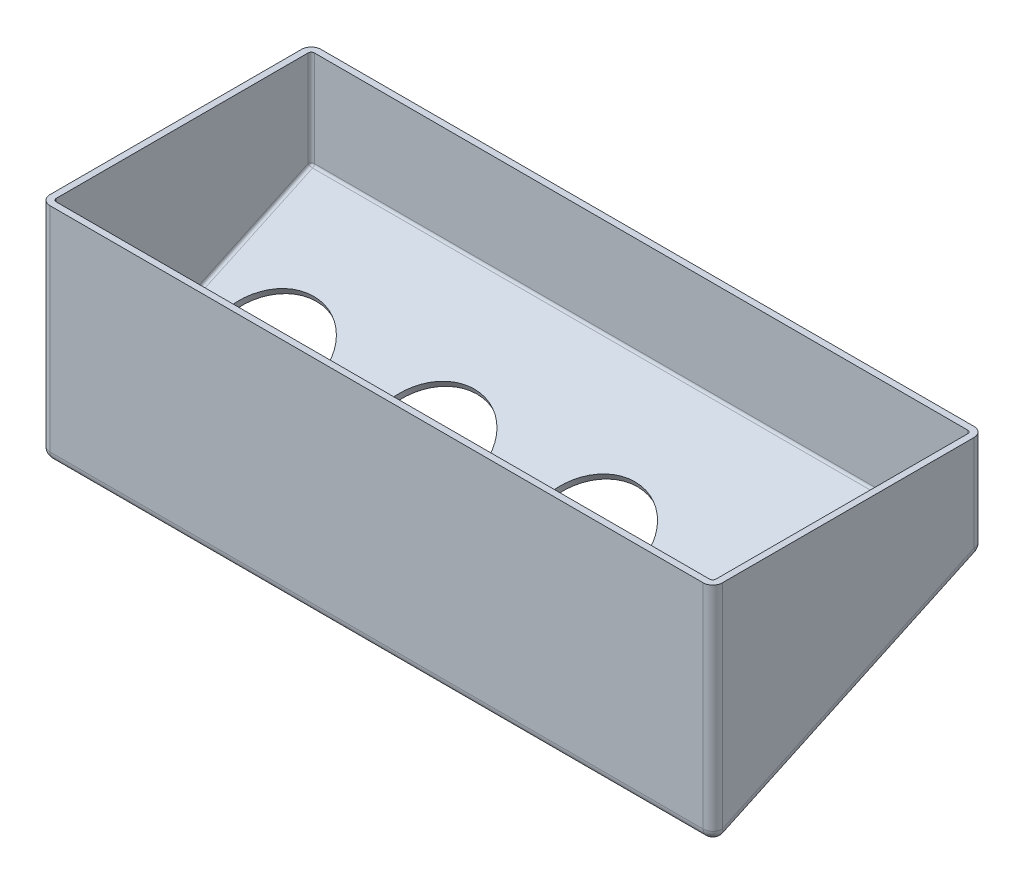
ISO-10303-21;
HEADER;
FILE_DESCRIPTION(('STEP AP214'),'2;1');
FILE_NAME('part.step','',(''),(''),'','','');
FILE_SCHEMA(('AUTOMOTIVE_DESIGN { 1 0 10303 214 1 1 1 1 }'));
ENDSEC;
DATA;
#1=APPLICATION_CONTEXT('core data for automotive mechanical design processes');
#2=APPLICATION_PROTOCOL_DEFINITION('international standard','automotive_design',2000,#1);
#3=PRODUCT_CONTEXT('',#1,'mechanical');
#4=PRODUCT('Part','Part','',(#3));
#5=PRODUCT_RELATED_PRODUCT_CATEGORY('part','',(#4));
#6=PRODUCT_DEFINITION_FORMATION('','',#4);
#7=PRODUCT_DEFINITION_CONTEXT('part definition',#1,'design');
#8=PRODUCT_DEFINITION('design','',#6,#7);
#9=PRODUCT_DEFINITION_SHAPE('','',#8);
#10=(LENGTH_UNIT() NAMED_UNIT(*) SI_UNIT(.MILLI.,.METRE.));
#11=(NAMED_UNIT(*) PLANE_ANGLE_UNIT() SI_UNIT($,.RADIAN.));
#12=(NAMED_UNIT(*) SI_UNIT($,.STERADIAN.) SOLID_ANGLE_UNIT());
#13=UNCERTAINTY_MEASURE_WITH_UNIT(LENGTH_MEASURE(1.E-05),#10,'distance_accuracy_value','');
#14=(GEOMETRIC_REPRESENTATION_CONTEXT(3) GLOBAL_UNCERTAINTY_ASSIGNED_CONTEXT((#13)) GLOBAL_UNIT_ASSIGNED_CONTEXT((#10,
#11,#12)) REPRESENTATION_CONTEXT('',''));
#15=CARTESIAN_POINT('',(0.,0.,0.));
#16=DIRECTION('',(0.,0.,1.));
#17=DIRECTION('',(1.,0.,0.));
#18=AXIS2_PLACEMENT_3D('',#15,#16,#17);
#19=CARTESIAN_POINT('',(167.4876,62.928311729549,-134.9502));
#20=DIRECTION('',(0.,0.,1.));
#21=DIRECTION('',(1.,0.,0.));
#22=AXIS2_PLACEMENT_3D('',#19,#20,#21);
#23=PLANE('',#22);
#24=DIRECTION('',(-1.,0.,0.));
#25=VECTOR('',#24,1.);
#26=CARTESIAN_POINT('',(167.4876,65.9623588466446,-134.9502));
#27=LINE('',#26,#25);
#28=CARTESIAN_POINT('',(162.7251,65.9623588466446,-134.9502));
#29=VERTEX_POINT('',#28);
#30=CARTESIAN_POINT('',(-162.7251,65.9623588466446,-134.9502));
#31=VERTEX_POINT('',#30);
#32=EDGE_CURVE('E283',#29,#31,#27,.T.);
#33=ORIENTED_EDGE('',*,*,#32,.T.);
#34=DIRECTION('',(0.,1.,0.));
#35=VECTOR('',#34,1.);
#36=CARTESIAN_POINT('',(-162.7251,62.928311729549,-134.9502));
#37=LINE('',#36,#35);
#38=CARTESIAN_POINT('',(-162.7251,113.728311729549,-134.9502));
#39=VERTEX_POINT('',#38);
#40=EDGE_CURVE('E285',#31,#39,#37,.T.);
#41=ORIENTED_EDGE('',*,*,#40,.T.);
#42=DIRECTION('',(-1.,0.,0.));
#43=VECTOR('',#42,1.);
#44=CARTESIAN_POINT('',(167.4876,113.728311729549,-134.9502));
#45=LINE('',#44,#43);
#46=CARTESIAN_POINT('',(162.7251,113.728311729549,-134.9502));
#47=VERTEX_POINT('',#46);
#48=EDGE_CURVE('E256',#47,#39,#45,.T.);
#49=ORIENTED_EDGE('',*,*,#48,.F.);
#50=DIRECTION('',(0.,1.,0.));
#51=VECTOR('',#50,1.);
#52=CARTESIAN_POINT('',(162.7251,62.928311729549,-134.9502));
#53=LINE('',#52,#51);
#54=EDGE_CURVE('E281',#47,#29,#53,.F.);
#55=ORIENTED_EDGE('',*,*,#54,.T.);
#56=EDGE_LOOP('',(#33,#41,#49,#55));
#57=FACE_BOUND('',#56,.T.);
#58=ADVANCED_FACE('F34',(#57),#23,.F.);
#59=CARTESIAN_POINT('',(167.4876,113.728311729549,-134.9502));
#60=DIRECTION('',(0.,-1.,0.));
#61=DIRECTION('',(0.,0.,-1.));
#62=AXIS2_PLACEMENT_3D('',#59,#60,#61);
#63=PLANE('',#62);
#64=DIRECTION('',(-1.,0.,0.));
#65=VECTOR('',#64,1.);
#66=CARTESIAN_POINT('',(167.4876,113.728311729549,-131.7752));
#67=LINE('',#66,#65);
#68=CARTESIAN_POINT('',(162.7251,113.728311729549,-131.7752));
#69=VERTEX_POINT('',#68);
#70=CARTESIAN_POINT('',(-162.7251,113.728311729549,-131.7752));
#71=VERTEX_POINT('',#70);
#72=EDGE_CURVE('E191',#69,#71,#67,.T.);
#73=ORIENTED_EDGE('',*,*,#72,.F.);
#74=CARTESIAN_POINT('',(162.7251,113.728311729549,-130.1877));
#75=DIRECTION('',(0.,-1.,0.));
#76=DIRECTION('',(0.,0.,-1.));
#77=AXIS2_PLACEMENT_3D('',#74,#75,#76);
#78=CIRCLE('',#77,1.5875);
#79=CARTESIAN_POINT('',(164.3126,113.728311729549,-130.1877));
#80=VERTEX_POINT('',#79);
#81=EDGE_CURVE('E240',#80,#69,#78,.F.);
#82=ORIENTED_EDGE('',*,*,#81,.F.);
#83=DIRECTION('',(0.,0.,1.));
#84=VECTOR('',#83,1.);
#85=CARTESIAN_POINT('',(164.3126,113.728311729549,-134.9502));
#86=LINE('',#85,#84);
#87=CARTESIAN_POINT('',(164.3126,113.728311729549,-4.7625));
#88=VERTEX_POINT('',#87);
#89=EDGE_CURVE('E51',#80,#88,#86,.T.);
#90=ORIENTED_EDGE('',*,*,#89,.T.);
#91=CARTESIAN_POINT('',(162.7251,113.728311729549,-4.7625));
#92=DIRECTION('',(0.,-1.,0.));
#93=DIRECTION('',(0.,0.,-1.));
#94=AXIS2_PLACEMENT_3D('',#91,#92,#93);
#95=CIRCLE('',#94,1.5875);
#96=CARTESIAN_POINT('',(162.7251,113.728311729549,-3.175));
#97=VERTEX_POINT('',#96);
#98=EDGE_CURVE('E195',#97,#88,#95,.F.);
#99=ORIENTED_EDGE('',*,*,#98,.F.);
#100=DIRECTION('',(-1.,0.,0.));
#101=VECTOR('',#100,1.);
#102=CARTESIAN_POINT('',(167.4876,113.728311729549,-3.175));
#103=LINE('',#102,#101);
#104=CARTESIAN_POINT('',(-162.7251,113.728311729549,-3.175));
#105=VERTEX_POINT('',#104);
#106=EDGE_CURVE('E230',#97,#105,#103,.T.);
#107=ORIENTED_EDGE('',*,*,#106,.T.);
#108=CARTESIAN_POINT('',(-162.7251,113.728311729549,-4.7625));
#109=DIRECTION('',(0.,-1.,0.));
#110=DIRECTION('',(0.,0.,-1.));
#111=AXIS2_PLACEMENT_3D('',#108,#109,#110);
#112=CIRCLE('',#111,1.5875);
#113=CARTESIAN_POINT('',(-164.3126,113.728311729549,-4.7625));
#114=VERTEX_POINT('',#113);
#115=EDGE_CURVE('E234',#114,#105,#112,.F.);
#116=ORIENTED_EDGE('',*,*,#115,.F.);
#117=DIRECTION('',(0.,0.,1.));
#118=VECTOR('',#117,1.);
#119=CARTESIAN_POINT('',(-164.3126,113.728311729549,-134.9502));
#120=LINE('',#119,#118);
#121=CARTESIAN_POINT('',(-164.3126,113.728311729549,-130.1877));
#122=VERTEX_POINT('',#121);
#123=EDGE_CURVE('E235',#122,#114,#120,.T.);
#124=ORIENTED_EDGE('',*,*,#123,.F.);
#125=CARTESIAN_POINT('',(-162.7251,113.728311729549,-130.1877));
#126=DIRECTION('',(0.,-1.,0.));
#127=DIRECTION('',(0.,0.,-1.));
#128=AXIS2_PLACEMENT_3D('',#125,#126,#127);
#129=CIRCLE('',#128,1.5875);
#130=EDGE_CURVE('E231',#71,#122,#129,.F.);
#131=ORIENTED_EDGE('',*,*,#130,.F.);
#132=EDGE_LOOP('',(#73,#82,#90,#99,#107,#116,#124,#131));
#133=FACE_BOUND('',#132,.T.);
#134=ORIENTED_EDGE('',*,*,#48,.T.);
#135=CARTESIAN_POINT('',(-162.7251,113.728311729549,-130.1877));
#136=DIRECTION('',(0.,-1.,0.));
#137=DIRECTION('',(0.,0.,-1.));
#138=AXIS2_PLACEMENT_3D('',#135,#136,#137);
#139=CIRCLE('',#138,4.7625);
#140=CARTESIAN_POINT('',(-167.4876,113.728311729549,-130.1877));
#141=VERTEX_POINT('',#140);
#142=EDGE_CURVE('E293',#39,#141,#139,.F.);
#143=ORIENTED_EDGE('',*,*,#142,.T.);
#144=DIRECTION('',(0.,0.,1.));
#145=VECTOR('',#144,1.);
#146=CARTESIAN_POINT('',(-167.4876,113.728311729549,-134.9502));
#147=LINE('',#146,#145);
#148=CARTESIAN_POINT('',(-167.4876,113.728311729549,-4.7625));
#149=VERTEX_POINT('',#148);
#150=EDGE_CURVE('E250',#141,#149,#147,.T.);
#151=ORIENTED_EDGE('',*,*,#150,.T.);
#152=CARTESIAN_POINT('',(-162.7251,113.728311729549,-4.7625));
#153=DIRECTION('',(0.,-1.,0.));
#154=DIRECTION('',(0.,0.,-1.));
#155=AXIS2_PLACEMENT_3D('',#152,#153,#154);
#156=CIRCLE('',#155,4.7625);
#157=CARTESIAN_POINT('',(-162.7251,113.728311729549,0.));
#158=VERTEX_POINT('',#157);
#159=EDGE_CURVE('E291',#149,#158,#156,.F.);
#160=ORIENTED_EDGE('',*,*,#159,.T.);
#161=DIRECTION('',(-1.,0.,0.));
#162=VECTOR('',#161,1.);
#163=CARTESIAN_POINT('',(167.4876,113.728311729549,0.));
#164=LINE('',#163,#162);
#165=CARTESIAN_POINT('',(162.7251,113.728311729549,0.));
#166=VERTEX_POINT('',#165);
#167=EDGE_CURVE('E249',#166,#158,#164,.T.);
#168=ORIENTED_EDGE('',*,*,#167,.F.);
#169=CARTESIAN_POINT('',(162.7251,113.728311729549,-4.7625));
#170=DIRECTION('',(0.,-1.,0.));
#171=DIRECTION('',(0.,0.,-1.));
#172=AXIS2_PLACEMENT_3D('',#169,#170,#171);
#173=CIRCLE('',#172,4.7625);
#174=CARTESIAN_POINT('',(167.4876,113.728311729549,-4.7625));
#175=VERTEX_POINT('',#174);
#176=EDGE_CURVE('E287',#166,#175,#173,.F.);
#177=ORIENTED_EDGE('',*,*,#176,.T.);
#178=DIRECTION('',(0.,0.,1.));
#179=VECTOR('',#178,1.);
#180=CARTESIAN_POINT('',(167.4876,113.728311729549,-134.9502));
#181=LINE('',#180,#179);
#182=CARTESIAN_POINT('',(167.4876,113.728311729549,-130.1877));
#183=VERTEX_POINT('',#182);
#184=EDGE_CURVE('E246',#183,#175,#181,.T.);
#185=ORIENTED_EDGE('',*,*,#184,.F.);
#186=CARTESIAN_POINT('',(162.7251,113.728311729549,-130.1877));
#187=DIRECTION('',(0.,-1.,0.));
#188=DIRECTION('',(0.,0.,-1.));
#189=AXIS2_PLACEMENT_3D('',#186,#187,#188);
#190=CIRCLE('',#189,4.7625);
#191=EDGE_CURVE('E289',#183,#47,#190,.F.);
#192=ORIENTED_EDGE('',*,*,#191,.T.);
#193=EDGE_LOOP('',(#134,#143,#151,#160,#168,#177,#185,#192));
#194=FACE_BOUND('',#193,.T.);
#195=ADVANCED_FACE('F432',(#133,#194),#63,.F.);
#196=CARTESIAN_POINT('',(167.4876,113.728311729549,0.));
#197=DIRECTION('',(0.,0.,-1.));
#198=DIRECTION('',(-1.,0.,0.));
#199=AXIS2_PLACEMENT_3D('',#196,#197,#198);
#200=PLANE('',#199);
#201=ORIENTED_EDGE('',*,*,#167,.T.);
#202=DIRECTION('',(0.,-1.,0.));
#203=VECTOR('',#202,1.);
#204=CARTESIAN_POINT('',(-162.7251,113.728311729549,0.));
#205=LINE('',#204,#203);
#206=CARTESIAN_POINT('',(-162.7251,7.47562756102206,0.));
#207=VERTEX_POINT('',#206);
#208=EDGE_CURVE('E11',#158,#207,#205,.T.);
#209=ORIENTED_EDGE('',*,*,#208,.T.);
#210=DIRECTION('',(-1.,0.,0.));
#211=VECTOR('',#210,1.);
#212=CARTESIAN_POINT('',(167.4876,7.47562756102206,0.));
#213=LINE('',#212,#211);
#214=CARTESIAN_POINT('',(162.7251,7.47562756102206,0.));
#215=VERTEX_POINT('',#214);
#216=EDGE_CURVE('E58',#207,#215,#213,.F.);
#217=ORIENTED_EDGE('',*,*,#216,.T.);
#218=DIRECTION('',(0.,-1.,0.));
#219=VECTOR('',#218,1.);
#220=CARTESIAN_POINT('',(162.7251,113.728311729549,0.));
#221=LINE('',#220,#219);
#222=EDGE_CURVE('E43',#215,#166,#221,.F.);
#223=ORIENTED_EDGE('',*,*,#222,.T.);
#224=EDGE_LOOP('',(#201,#209,#217,#223));
#225=FACE_BOUND('',#224,.T.);
#226=ADVANCED_FACE('F438',(#225),#200,.F.);
#227=CARTESIAN_POINT('',(167.4876,0.,0.));
#228=DIRECTION('',(0.,0.906307787036649,0.422618261740701));
#229=DIRECTION('',(0.,-0.422618261740701,0.906307787036649));
#230=AXIS2_PLACEMENT_3D('',#227,#228,#229);
#231=PLANE('',#230);
#232=CARTESIAN_POINT('',(-124.5824,33.408426146961,-71.64460107549));
#233=DIRECTION('',(0.,-0.906307787036649,-0.422618261740701));
#234=DIRECTION('',(0.,0.422618261740701,-0.906307787036649));
#235=AXIS2_PLACEMENT_3D('',#232,#233,#234);
#236=CIRCLE('',#235,25.4);
#237=CARTESIAN_POINT('',(-124.5824,44.1429299951748,-94.6648188662209));
#238=VERTEX_POINT('',#237);
#239=EDGE_CURVE('E335',#238,#238,#236,.T.);
#240=ORIENTED_EDGE('',*,*,#239,.F.);
#241=EDGE_LOOP('',(#240));
#242=FACE_BOUND('',#241,.T.);
#243=CARTESIAN_POINT('',(-44.5823999999999,33.408426146961,-71.64460107549));
#244=DIRECTION('',(0.,-0.906307787036649,-0.422618261740701));
#245=DIRECTION('',(0.,0.422618261740701,-0.906307787036649));
#246=AXIS2_PLACEMENT_3D('',#243,#244,#245);
#247=CIRCLE('',#246,25.4);
#248=CARTESIAN_POINT('',(-44.5823999999999,44.1429299951748,-94.6648188662209));
#249=VERTEX_POINT('',#248);
#250=EDGE_CURVE('E819',#249,#249,#247,.T.);
#251=ORIENTED_EDGE('',*,*,#250,.F.);
#252=EDGE_LOOP('',(#251));
#253=FACE_BOUND('',#252,.T.);
#254=CARTESIAN_POINT('',(35.4176000000001,33.408426146961,-71.64460107549));
#255=DIRECTION('',(0.,-0.906307787036649,-0.422618261740701));
#256=DIRECTION('',(0.,0.422618261740701,-0.906307787036649));
#257=AXIS2_PLACEMENT_3D('',#254,#255,#256);
#258=CIRCLE('',#257,25.4);
#259=CARTESIAN_POINT('',(35.4176000000001,44.1429299951748,-94.6648188662209));
#260=VERTEX_POINT('',#259);
#261=EDGE_CURVE('E816',#260,#260,#258,.T.);
#262=ORIENTED_EDGE('',*,*,#261,.F.);
#263=EDGE_LOOP('',(#262));
#264=FACE_BOUND('',#263,.T.);
#265=CARTESIAN_POINT('',(115.4176,33.408426146961,-71.64460107549));
#266=DIRECTION('',(0.,-0.906307787036649,-0.422618261740701));
#267=DIRECTION('',(0.,0.422618261740701,-0.906307787036649));
#268=AXIS2_PLACEMENT_3D('',#265,#266,#267);
#269=CIRCLE('',#268,25.4000000000001);
#270=CARTESIAN_POINT('',(115.4176,44.1429299951748,-94.664818866221));
#271=VERTEX_POINT('',#270);
#272=EDGE_CURVE('E813',#271,#271,#269,.T.);
#273=ORIENTED_EDGE('',*,*,#272,.F.);
#274=EDGE_LOOP('',(#273));
#275=FACE_BOUND('',#274,.T.);
#276=DIRECTION('',(0.,0.422618261740701,-0.906307787036649));
#277=VECTOR('',#276,1.);
#278=CARTESIAN_POINT('',(-162.7251,0.,0.));
#279=LINE('',#278,#277);
#280=CARTESIAN_POINT('',(-162.7251,3.15933672526002,-6.77521947154009));
#281=VERTEX_POINT('',#280);
#282=CARTESIAN_POINT('',(-162.7251,61.6460680108826,-132.20041947154));
#283=VERTEX_POINT('',#282);
#284=EDGE_CURVE('E263',#281,#283,#279,.T.);
#285=ORIENTED_EDGE('',*,*,#284,.T.);
#286=DIRECTION('',(-1.,0.,0.));
#287=VECTOR('',#286,1.);
#288=CARTESIAN_POINT('',(167.4876,61.6460680108826,-132.20041947154));
#289=LINE('',#288,#287);
#290=CARTESIAN_POINT('',(162.7251,61.6460680108826,-132.20041947154));
#291=VERTEX_POINT('',#290);
#292=EDGE_CURVE('E266',#283,#291,#289,.F.);
#293=ORIENTED_EDGE('',*,*,#292,.T.);
#294=DIRECTION('',(0.,0.422618261740701,-0.906307787036649));
#295=VECTOR('',#294,1.);
#296=CARTESIAN_POINT('',(162.7251,0.,0.));
#297=LINE('',#296,#295);
#298=CARTESIAN_POINT('',(162.7251,3.15933672526002,-6.77521947154009));
#299=VERTEX_POINT('',#298);
#300=EDGE_CURVE('E261',#291,#299,#297,.F.);
#301=ORIENTED_EDGE('',*,*,#300,.T.);
#302=DIRECTION('',(-1.,0.,0.));
#303=VECTOR('',#302,1.);
#304=CARTESIAN_POINT('',(167.4876,3.15933672526002,-6.77521947154009));
#305=LINE('',#304,#303);
#306=EDGE_CURVE('E259',#299,#281,#305,.T.);
#307=ORIENTED_EDGE('',*,*,#306,.T.);
#308=EDGE_LOOP('',(#285,#293,#301,#307));
#309=FACE_BOUND('',#308,.T.);
#310=ADVANCED_FACE('F514',(#242,#253,#264,#275,#309),#231,.F.);
#311=CARTESIAN_POINT('',(167.4876,113.728311729549,-134.9502));
#312=DIRECTION('',(1.,0.,0.));
#313=DIRECTION('',(0.,0.,-1.));
#314=AXIS2_PLACEMENT_3D('',#311,#312,#313);
#315=PLANE('',#314);
#316=DIRECTION('',(0.,0.422618261740701,-0.906307787036649));
#317=VECTOR('',#316,1.);
#318=CARTESIAN_POINT('',(167.4876,67.244602565311,-132.93748052846));
#319=LINE('',#318,#317);
#320=CARTESIAN_POINT('',(167.4876,7.47562756102207,-4.7625));
#321=VERTEX_POINT('',#320);
#322=CARTESIAN_POINT('',(167.4876,65.9623588466447,-130.1877));
#323=VERTEX_POINT('',#322);
#324=EDGE_CURVE('E277',#321,#323,#319,.T.);
#325=ORIENTED_EDGE('',*,*,#324,.T.);
#326=DIRECTION('',(0.,1.,0.));
#327=VECTOR('',#326,1.);
#328=CARTESIAN_POINT('',(167.4876,113.728311729549,-130.1877));
#329=LINE('',#328,#327);
#330=EDGE_CURVE('E279',#323,#183,#329,.T.);
#331=ORIENTED_EDGE('',*,*,#330,.T.);
#332=ORIENTED_EDGE('',*,*,#184,.T.);
#333=DIRECTION('',(0.,-1.,0.));
#334=VECTOR('',#333,1.);
#335=CARTESIAN_POINT('',(167.4876,0.,-4.7625));
#336=LINE('',#335,#334);
#337=EDGE_CURVE('E275',#175,#321,#336,.T.);
#338=ORIENTED_EDGE('',*,*,#337,.T.);
#339=EDGE_LOOP('',(#325,#331,#332,#338));
#340=FACE_BOUND('',#339,.T.);
#341=ADVANCED_FACE('F503',(#340),#315,.T.);
#342=CARTESIAN_POINT('',(-167.4876,113.728311729549,-134.9502));
#343=DIRECTION('',(1.,0.,0.));
#344=DIRECTION('',(0.,0.,-1.));
#345=AXIS2_PLACEMENT_3D('',#342,#343,#344);
#346=PLANE('',#345);
#347=ORIENTED_EDGE('',*,*,#150,.F.);
#348=DIRECTION('',(0.,1.,0.));
#349=VECTOR('',#348,1.);
#350=CARTESIAN_POINT('',(-167.4876,113.728311729549,-130.1877));
#351=LINE('',#350,#349);
#352=CARTESIAN_POINT('',(-167.4876,65.9623588466446,-130.1877));
#353=VERTEX_POINT('',#352);
#354=EDGE_CURVE('E273',#141,#353,#351,.F.);
#355=ORIENTED_EDGE('',*,*,#354,.T.);
#356=DIRECTION('',(0.,0.422618261740701,-0.906307787036649));
#357=VECTOR('',#356,1.);
#358=CARTESIAN_POINT('',(-167.4876,76.317797279273,-152.395009383682));
#359=LINE('',#358,#357);
#360=CARTESIAN_POINT('',(-167.4876,7.47562756102206,-4.7625));
#361=VERTEX_POINT('',#360);
#362=EDGE_CURVE('E270',#353,#361,#359,.F.);
#363=ORIENTED_EDGE('',*,*,#362,.T.);
#364=DIRECTION('',(0.,-1.,0.));
#365=VECTOR('',#364,1.);
#366=CARTESIAN_POINT('',(-167.4876,113.728311729549,-4.7625));
#367=LINE('',#366,#365);
#368=EDGE_CURVE('E268',#361,#149,#367,.F.);
#369=ORIENTED_EDGE('',*,*,#368,.T.);
#370=EDGE_LOOP('',(#347,#355,#363,#369));
#371=FACE_BOUND('',#370,.T.);
#372=ADVANCED_FACE('F488',(#371),#346,.F.);
#373=CARTESIAN_POINT('',(162.7251,113.728311729549,-4.7625));
#374=DIRECTION('',(0.,1.,0.));
#375=DIRECTION('',(0.,0.,1.));
#376=AXIS2_PLACEMENT_3D('',#373,#374,#375);
#377=CYLINDRICAL_SURFACE('',#376,4.7625);
#378=ORIENTED_EDGE('',*,*,#176,.F.);
#379=ORIENTED_EDGE('',*,*,#222,.F.);
#380=CARTESIAN_POINT('',(162.7251,7.47562756102207,-4.7625));
#381=DIRECTION('',(0.,-1.,0.));
#382=DIRECTION('',(0.,0.,-1.));
#383=AXIS2_PLACEMENT_3D('',#380,#381,#382);
#384=CIRCLE('',#383,4.7625);
#385=EDGE_CURVE('E253',#321,#215,#384,.T.);
#386=ORIENTED_EDGE('',*,*,#385,.F.);
#387=ORIENTED_EDGE('',*,*,#337,.F.);
#388=EDGE_LOOP('',(#378,#379,#386,#387));
#389=FACE_BOUND('',#388,.T.);
#390=ADVANCED_FACE('F36',(#389),#377,.T.);
#391=CARTESIAN_POINT('',(162.7251,76.317797279273,-152.395009383682));
#392=DIRECTION('',(0.,-0.422618261740701,0.906307787036649));
#393=DIRECTION('',(0.,-0.906307787036649,-0.422618261740701));
#394=AXIS2_PLACEMENT_3D('',#391,#392,#393);
#395=CYLINDRICAL_SURFACE('',#394,4.7625);
#396=CARTESIAN_POINT('',(162.7251,65.9623588466447,-130.1877));
#397=DIRECTION('',(0.,0.422618261740699,-0.90630778703665));
#398=DIRECTION('',(0.,0.90630778703665,0.422618261740699));
#399=AXIS2_PLACEMENT_3D('',#396,#397,#398);
#400=CIRCLE('',#399,4.7625);
#401=EDGE_CURVE('E323',#323,#291,#400,.T.);
#402=ORIENTED_EDGE('',*,*,#401,.F.);
#403=ORIENTED_EDGE('',*,*,#324,.F.);
#404=CARTESIAN_POINT('',(162.7251,7.47562756102206,-4.7625));
#405=DIRECTION('',(0.,-0.422618261740701,0.906307787036649));
#406=DIRECTION('',(0.,-0.906307787036649,-0.422618261740701));
#407=AXIS2_PLACEMENT_3D('',#404,#405,#406);
#408=CIRCLE('',#407,4.7625);
#409=EDGE_CURVE('E326',#299,#321,#408,.T.);
#410=ORIENTED_EDGE('',*,*,#409,.F.);
#411=ORIENTED_EDGE('',*,*,#300,.F.);
#412=EDGE_LOOP('',(#402,#403,#410,#411));
#413=FACE_BOUND('',#412,.T.);
#414=ADVANCED_FACE('F481',(#413),#395,.T.);
#415=CARTESIAN_POINT('',(162.7251,113.728311729549,-130.1877));
#416=DIRECTION('',(0.,-1.,0.));
#417=DIRECTION('',(0.,0.,-1.));
#418=AXIS2_PLACEMENT_3D('',#415,#416,#417);
#419=CYLINDRICAL_SURFACE('',#418,4.7625);
#420=ORIENTED_EDGE('',*,*,#191,.F.);
#421=ORIENTED_EDGE('',*,*,#330,.F.);
#422=CARTESIAN_POINT('',(162.7251,65.9623588466446,-130.1877));
#423=DIRECTION('',(0.,-1.,0.));
#424=DIRECTION('',(1.,0.,0.));
#425=AXIS2_PLACEMENT_3D('',#422,#423,#424);
#426=CIRCLE('',#425,4.7625);
#427=EDGE_CURVE('E320',#29,#323,#426,.T.);
#428=ORIENTED_EDGE('',*,*,#427,.F.);
#429=ORIENTED_EDGE('',*,*,#54,.F.);
#430=EDGE_LOOP('',(#420,#421,#428,#429));
#431=FACE_BOUND('',#430,.T.);
#432=ADVANCED_FACE('F478',(#431),#419,.T.);
#433=CARTESIAN_POINT('',(162.7251,7.47562756102206,-4.7625));
#434=DIRECTION('',(1.,0.,0.));
#435=DIRECTION('',(0.,1.,0.));
#436=AXIS2_PLACEMENT_3D('',#433,#434,#435);
#437=SPHERICAL_SURFACE('',#436,4.7625);
#438=ORIENTED_EDGE('',*,*,#409,.T.);
#439=ORIENTED_EDGE('',*,*,#385,.T.);
#440=CARTESIAN_POINT('',(162.7251,7.47562756102206,-4.7625));
#441=DIRECTION('',(1.,0.,0.));
#442=DIRECTION('',(0.,0.,-1.));
#443=AXIS2_PLACEMENT_3D('',#440,#441,#442);
#444=CIRCLE('',#443,4.7625);
#445=EDGE_CURVE('E317',#299,#215,#444,.F.);
#446=ORIENTED_EDGE('',*,*,#445,.F.);
#447=EDGE_LOOP('',(#438,#439,#446));
#448=FACE_BOUND('',#447,.T.);
#449=ADVANCED_FACE('F474',(#448),#437,.T.);
#450=CARTESIAN_POINT('',(162.7251,65.9623588466446,-130.1877));
#451=DIRECTION('',(1.,0.,0.));
#452=DIRECTION('',(0.,1.,0.));
#453=AXIS2_PLACEMENT_3D('',#450,#451,#452);
#454=SPHERICAL_SURFACE('',#453,4.7625);
#455=ORIENTED_EDGE('',*,*,#427,.T.);
#456=ORIENTED_EDGE('',*,*,#401,.T.);
#457=CARTESIAN_POINT('',(162.7251,65.9623588466446,-130.1877));
#458=DIRECTION('',(1.,0.,0.));
#459=DIRECTION('',(0.,0.,-1.));
#460=AXIS2_PLACEMENT_3D('',#457,#458,#459);
#461=CIRCLE('',#460,4.7625);
#462=EDGE_CURVE('E314',#29,#291,#461,.F.);
#463=ORIENTED_EDGE('',*,*,#462,.F.);
#464=EDGE_LOOP('',(#455,#456,#463));
#465=FACE_BOUND('',#464,.T.);
#466=ADVANCED_FACE('F470',(#465),#454,.T.);
#467=CARTESIAN_POINT('',(-162.7251,113.728311729549,-4.7625));
#468=DIRECTION('',(0.,-1.,0.));
#469=DIRECTION('',(0.,0.,-1.));
#470=AXIS2_PLACEMENT_3D('',#467,#468,#469);
#471=CYLINDRICAL_SURFACE('',#470,4.7625);
#472=ORIENTED_EDGE('',*,*,#159,.F.);
#473=ORIENTED_EDGE('',*,*,#368,.F.);
#474=CARTESIAN_POINT('',(-162.7251,7.47562756102206,-4.7625));
#475=DIRECTION('',(0.,-1.,0.));
#476=DIRECTION('',(1.,0.,0.));
#477=AXIS2_PLACEMENT_3D('',#474,#475,#476);
#478=CIRCLE('',#477,4.7625);
#479=EDGE_CURVE('E311',#207,#361,#478,.T.);
#480=ORIENTED_EDGE('',*,*,#479,.F.);
#481=ORIENTED_EDGE('',*,*,#208,.F.);
#482=EDGE_LOOP('',(#472,#473,#480,#481));
#483=FACE_BOUND('',#482,.T.);
#484=ADVANCED_FACE('F466',(#483),#471,.T.);
#485=CARTESIAN_POINT('',(167.4876,7.47562756102206,-4.7625));
#486=DIRECTION('',(-1.,0.,0.));
#487=DIRECTION('',(0.,0.,1.));
#488=AXIS2_PLACEMENT_3D('',#485,#486,#487);
#489=CYLINDRICAL_SURFACE('',#488,4.7625);
#490=ORIENTED_EDGE('',*,*,#445,.T.);
#491=ORIENTED_EDGE('',*,*,#216,.F.);
#492=CARTESIAN_POINT('',(-162.7251,7.47562756102206,-4.7625));
#493=DIRECTION('',(-1.,0.,0.));
#494=DIRECTION('',(0.,0.,1.));
#495=AXIS2_PLACEMENT_3D('',#492,#493,#494);
#496=CIRCLE('',#495,4.7625);
#497=EDGE_CURVE('E308',#281,#207,#496,.T.);
#498=ORIENTED_EDGE('',*,*,#497,.F.);
#499=ORIENTED_EDGE('',*,*,#306,.F.);
#500=EDGE_LOOP('',(#490,#491,#498,#499));
#501=FACE_BOUND('',#500,.T.);
#502=ADVANCED_FACE('F462',(#501),#489,.T.);
#503=CARTESIAN_POINT('',(167.4876,65.9623588466446,-130.1877));
#504=DIRECTION('',(-1.,0.,0.));
#505=DIRECTION('',(0.,0.,1.));
#506=AXIS2_PLACEMENT_3D('',#503,#504,#505);
#507=CYLINDRICAL_SURFACE('',#506,4.7625);
#508=ORIENTED_EDGE('',*,*,#462,.T.);
#509=ORIENTED_EDGE('',*,*,#292,.F.);
#510=CARTESIAN_POINT('',(-162.7251,65.9623588466446,-130.1877));
#511=DIRECTION('',(-1.,0.,0.));
#512=DIRECTION('',(0.,0.,1.));
#513=AXIS2_PLACEMENT_3D('',#510,#511,#512);
#514=CIRCLE('',#513,4.7625);
#515=EDGE_CURVE('E305',#31,#283,#514,.T.);
#516=ORIENTED_EDGE('',*,*,#515,.F.);
#517=ORIENTED_EDGE('',*,*,#32,.F.);
#518=EDGE_LOOP('',(#508,#509,#516,#517));
#519=FACE_BOUND('',#518,.T.);
#520=ADVANCED_FACE('F458',(#519),#507,.T.);
#521=CARTESIAN_POINT('',(-162.7251,62.928311729549,-130.1877));
#522=DIRECTION('',(0.,1.,0.));
#523=DIRECTION('',(0.,0.,1.));
#524=AXIS2_PLACEMENT_3D('',#521,#522,#523);
#525=CYLINDRICAL_SURFACE('',#524,4.7625);
#526=ORIENTED_EDGE('',*,*,#142,.F.);
#527=ORIENTED_EDGE('',*,*,#40,.F.);
#528=CARTESIAN_POINT('',(-162.7251,65.9623588466446,-130.1877));
#529=DIRECTION('',(0.,-1.,0.));
#530=DIRECTION('',(0.,0.,-1.));
#531=AXIS2_PLACEMENT_3D('',#528,#529,#530);
#532=CIRCLE('',#531,4.7625);
#533=EDGE_CURVE('E302',#353,#31,#532,.T.);
#534=ORIENTED_EDGE('',*,*,#533,.F.);
#535=ORIENTED_EDGE('',*,*,#354,.F.);
#536=EDGE_LOOP('',(#526,#527,#534,#535));
#537=FACE_BOUND('',#536,.T.);
#538=ADVANCED_FACE('F454',(#537),#525,.T.);
#539=CARTESIAN_POINT('',(-162.7251,7.47562756102206,-4.7625));
#540=DIRECTION('',(-1.,0.,0.));
#541=DIRECTION('',(0.,0.,1.));
#542=AXIS2_PLACEMENT_3D('',#539,#540,#541);
#543=SPHERICAL_SURFACE('',#542,4.7625);
#544=ORIENTED_EDGE('',*,*,#497,.T.);
#545=ORIENTED_EDGE('',*,*,#479,.T.);
#546=CARTESIAN_POINT('',(-162.7251,7.47562756102206,-4.7625));
#547=DIRECTION('',(0.,-0.422618261740701,0.906307787036649));
#548=DIRECTION('',(0.,-0.906307787036649,-0.422618261740701));
#549=AXIS2_PLACEMENT_3D('',#546,#547,#548);
#550=CIRCLE('',#549,4.7625);
#551=EDGE_CURVE('E299',#281,#361,#550,.F.);
#552=ORIENTED_EDGE('',*,*,#551,.F.);
#553=EDGE_LOOP('',(#544,#545,#552));
#554=FACE_BOUND('',#553,.T.);
#555=ADVANCED_FACE('F450',(#554),#543,.T.);
#556=CARTESIAN_POINT('',(-162.7251,65.9623588466446,-130.1877));
#557=DIRECTION('',(-1.,0.,0.));
#558=DIRECTION('',(0.,0.,1.));
#559=AXIS2_PLACEMENT_3D('',#556,#557,#558);
#560=SPHERICAL_SURFACE('',#559,4.7625);
#561=ORIENTED_EDGE('',*,*,#533,.T.);
#562=ORIENTED_EDGE('',*,*,#515,.T.);
#563=CARTESIAN_POINT('',(-162.7251,65.9623588466446,-130.1877));
#564=DIRECTION('',(0.,0.4226182617407,-0.90630778703665));
#565=DIRECTION('',(0.,0.90630778703665,0.4226182617407));
#566=AXIS2_PLACEMENT_3D('',#563,#564,#565);
#567=CIRCLE('',#566,4.7625);
#568=EDGE_CURVE('E297',#353,#283,#567,.F.);
#569=ORIENTED_EDGE('',*,*,#568,.F.);
#570=EDGE_LOOP('',(#561,#562,#569));
#571=FACE_BOUND('',#570,.T.);
#572=ADVANCED_FACE('F446',(#571),#560,.T.);
#573=CARTESIAN_POINT('',(-162.7251,4.31629083576204,2.01271947154009));
#574=DIRECTION('',(0.,0.422618261740701,-0.906307787036649));
#575=DIRECTION('',(0.,0.906307787036649,0.422618261740701));
#576=AXIS2_PLACEMENT_3D('',#573,#574,#575);
#577=CYLINDRICAL_SURFACE('',#576,4.7625);
#578=ORIENTED_EDGE('',*,*,#551,.T.);
#579=ORIENTED_EDGE('',*,*,#362,.F.);
#580=ORIENTED_EDGE('',*,*,#568,.T.);
#581=ORIENTED_EDGE('',*,*,#284,.F.);
#582=EDGE_LOOP('',(#578,#579,#580,#581));
#583=FACE_BOUND('',#582,.T.);
#584=ADVANCED_FACE('F443',(#583),#577,.T.);
#585=CARTESIAN_POINT('',(167.4876,62.928311729549,-131.7752));
#586=DIRECTION('',(0.,0.,1.));
#587=DIRECTION('',(1.,0.,0.));
#588=AXIS2_PLACEMENT_3D('',#585,#586,#587);
#589=PLANE('',#588);
#590=DIRECTION('',(1.,0.,0.));
#591=VECTOR('',#590,1.);
#592=CARTESIAN_POINT('',(167.4876,65.9623588466446,-131.7752));
#593=LINE('',#592,#591);
#594=CARTESIAN_POINT('',(162.7251,65.9623588466446,-131.7752));
#595=VERTEX_POINT('',#594);
#596=CARTESIAN_POINT('',(-162.7251,65.9623588466446,-131.7752));
#597=VERTEX_POINT('',#596);
#598=EDGE_CURVE('E175',#595,#597,#593,.F.);
#599=ORIENTED_EDGE('',*,*,#598,.F.);
#600=DIRECTION('',(0.,1.,0.));
#601=VECTOR('',#600,1.);
#602=CARTESIAN_POINT('',(162.7251,62.928311729549,-131.7752));
#603=LINE('',#602,#601);
#604=EDGE_CURVE('E186',#69,#595,#603,.F.);
#605=ORIENTED_EDGE('',*,*,#604,.F.);
#606=ORIENTED_EDGE('',*,*,#72,.T.);
#607=DIRECTION('',(0.,1.,0.));
#608=VECTOR('',#607,1.);
#609=CARTESIAN_POINT('',(-162.7251,62.928311729549,-131.7752));
#610=LINE('',#609,#608);
#611=EDGE_CURVE('E185',#597,#71,#610,.T.);
#612=ORIENTED_EDGE('',*,*,#611,.F.);
#613=EDGE_LOOP('',(#599,#605,#606,#612));
#614=FACE_BOUND('',#613,.T.);
#615=ADVANCED_FACE('F189',(#614),#589,.T.);
#616=CARTESIAN_POINT('',(167.4876,113.728311729549,-3.175));
#617=DIRECTION('',(0.,0.,-1.));
#618=DIRECTION('',(-1.,0.,0.));
#619=AXIS2_PLACEMENT_3D('',#616,#617,#618);
#620=PLANE('',#619);
#621=ORIENTED_EDGE('',*,*,#106,.F.);
#622=DIRECTION('',(0.,1.,0.));
#623=VECTOR('',#622,1.);
#624=CARTESIAN_POINT('',(162.7251,113.728311729549,-3.175));
#625=LINE('',#624,#623);
#626=CARTESIAN_POINT('',(162.7251,7.47562756102206,-3.175));
#627=VERTEX_POINT('',#626);
#628=EDGE_CURVE('E396',#627,#97,#625,.T.);
#629=ORIENTED_EDGE('',*,*,#628,.F.);
#630=DIRECTION('',(-1.,0.,0.));
#631=VECTOR('',#630,1.);
#632=CARTESIAN_POINT('',(167.4876,7.47562756102206,-3.175));
#633=LINE('',#632,#631);
#634=CARTESIAN_POINT('',(-162.7251,7.47562756102206,-3.175));
#635=VERTEX_POINT('',#634);
#636=EDGE_CURVE('E233',#635,#627,#633,.F.);
#637=ORIENTED_EDGE('',*,*,#636,.F.);
#638=DIRECTION('',(0.,1.,0.));
#639=VECTOR('',#638,1.);
#640=CARTESIAN_POINT('',(-162.7251,113.728311729549,-3.175));
#641=LINE('',#640,#639);
#642=EDGE_CURVE('E300',#105,#635,#641,.F.);
#643=ORIENTED_EDGE('',*,*,#642,.F.);
#644=EDGE_LOOP('',(#621,#629,#637,#643));
#645=FACE_BOUND('',#644,.T.);
#646=ADVANCED_FACE('F351',(#645),#620,.T.);
#647=CARTESIAN_POINT('',(167.4876,2.87752722384136,1.34181298102673));
#648=DIRECTION('',(0.,0.906307787036649,0.422618261740701));
#649=DIRECTION('',(0.,-0.422618261740701,0.906307787036649));
#650=AXIS2_PLACEMENT_3D('',#647,#648,#649);
#651=PLANE('',#650);
#652=CARTESIAN_POINT('',(-124.5824,36.2859533708024,-70.3027880944633));
#653=DIRECTION('',(0.,0.906307787036649,0.422618261740701));
#654=DIRECTION('',(0.,-0.422618261740701,0.906307787036649));
#655=AXIS2_PLACEMENT_3D('',#652,#653,#654);
#656=CIRCLE('',#655,25.4);
#657=CARTESIAN_POINT('',(-124.5824,25.5514495225885,-47.2825703037324));
#658=VERTEX_POINT('',#657);
#659=EDGE_CURVE('E38',#658,#658,#656,.T.);
#660=ORIENTED_EDGE('',*,*,#659,.F.);
#661=EDGE_LOOP('',(#660));
#662=FACE_BOUND('',#661,.T.);
#663=CARTESIAN_POINT('',(-44.5823999999999,36.2859533708024,-70.3027880944633));
#664=DIRECTION('',(0.,0.906307787036649,0.422618261740701));
#665=DIRECTION('',(0.,-0.422618261740701,0.906307787036649));
#666=AXIS2_PLACEMENT_3D('',#663,#664,#665);
#667=CIRCLE('',#666,25.4);
#668=CARTESIAN_POINT('',(-44.5823999999999,25.5514495225885,-47.2825703037324));
#669=VERTEX_POINT('',#668);
#670=EDGE_CURVE('E337',#669,#669,#667,.T.);
#671=ORIENTED_EDGE('',*,*,#670,.F.);
#672=EDGE_LOOP('',(#671));
#673=FACE_BOUND('',#672,.T.);
#674=CARTESIAN_POINT('',(35.4176000000001,36.2859533708024,-70.3027880944633));
#675=DIRECTION('',(0.,0.906307787036649,0.422618261740701));
#676=DIRECTION('',(0.,-0.422618261740701,0.906307787036649));
#677=AXIS2_PLACEMENT_3D('',#674,#675,#676);
#678=CIRCLE('',#677,25.4);
#679=CARTESIAN_POINT('',(35.4176000000001,25.5514495225885,-47.2825703037324));
#680=VERTEX_POINT('',#679);
#681=EDGE_CURVE('E334',#680,#680,#678,.T.);
#682=ORIENTED_EDGE('',*,*,#681,.F.);
#683=EDGE_LOOP('',(#682));
#684=FACE_BOUND('',#683,.T.);
#685=CARTESIAN_POINT('',(115.4176,36.2859533708024,-70.3027880944633));
#686=DIRECTION('',(0.,0.906307787036649,0.422618261740701));
#687=DIRECTION('',(0.,-0.422618261740701,0.906307787036649));
#688=AXIS2_PLACEMENT_3D('',#685,#686,#687);
#689=CIRCLE('',#688,25.4000000000001);
#690=CARTESIAN_POINT('',(115.4176,25.5514495225885,-47.2825703037323));
#691=VERTEX_POINT('',#690);
#692=EDGE_CURVE('E331',#691,#691,#689,.T.);
#693=ORIENTED_EDGE('',*,*,#692,.F.);
#694=EDGE_LOOP('',(#693));
#695=FACE_BOUND('',#694,.T.);
#696=DIRECTION('',(0.,-0.422618261740701,0.906307787036649));
#697=VECTOR('',#696,1.);
#698=CARTESIAN_POINT('',(-162.7251,2.87752722384136,1.34181298102673));
#699=LINE('',#698,#697);
#700=CARTESIAN_POINT('',(-162.7251,6.03686394910138,-5.43340649051337));
#701=VERTEX_POINT('',#700);
#702=CARTESIAN_POINT('',(-162.7251,64.523595234724,-130.858606490513));
#703=VERTEX_POINT('',#702);
#704=EDGE_CURVE('E361',#701,#703,#699,.F.);
#705=ORIENTED_EDGE('',*,*,#704,.F.);
#706=DIRECTION('',(1.,0.,0.));
#707=VECTOR('',#706,1.);
#708=CARTESIAN_POINT('',(167.4876,6.03686394910138,-5.43340649051337));
#709=LINE('',#708,#707);
#710=CARTESIAN_POINT('',(162.7251,6.03686394910138,-5.43340649051337));
#711=VERTEX_POINT('',#710);
#712=EDGE_CURVE('E229',#711,#701,#709,.F.);
#713=ORIENTED_EDGE('',*,*,#712,.F.);
#714=DIRECTION('',(0.,-0.422618261740701,0.906307787036649));
#715=VECTOR('',#714,1.);
#716=CARTESIAN_POINT('',(162.7251,2.87752722384136,1.34181298102673));
#717=LINE('',#716,#715);
#718=CARTESIAN_POINT('',(162.7251,64.523595234724,-130.858606490513));
#719=VERTEX_POINT('',#718);
#720=EDGE_CURVE('E365',#719,#711,#717,.T.);
#721=ORIENTED_EDGE('',*,*,#720,.F.);
#722=DIRECTION('',(1.,0.,0.));
#723=VECTOR('',#722,1.);
#724=CARTESIAN_POINT('',(167.4876,64.523595234724,-130.858606490513));
#725=LINE('',#724,#723);
#726=EDGE_CURVE('E221',#703,#719,#725,.T.);
#727=ORIENTED_EDGE('',*,*,#726,.F.);
#728=EDGE_LOOP('',(#705,#713,#721,#727));
#729=FACE_BOUND('',#728,.T.);
#730=ADVANCED_FACE('F347',(#662,#673,#684,#695,#729),#651,.T.);
#731=CARTESIAN_POINT('',(164.3126,113.728311729549,-134.9502));
#732=DIRECTION('',(1.,0.,0.));
#733=DIRECTION('',(0.,0.,-1.));
#734=AXIS2_PLACEMENT_3D('',#731,#732,#733);
#735=PLANE('',#734);
#736=DIRECTION('',(0.,-0.422618261740701,0.906307787036649));
#737=VECTOR('',#736,1.);
#738=CARTESIAN_POINT('',(164.3126,76.317797279273,-152.395009383682));
#739=LINE('',#738,#737);
#740=CARTESIAN_POINT('',(164.3126,7.47562756102207,-4.7625));
#741=VERTEX_POINT('',#740);
#742=CARTESIAN_POINT('',(164.3126,65.9623588466447,-130.1877));
#743=VERTEX_POINT('',#742);
#744=EDGE_CURVE('E393',#741,#743,#739,.F.);
#745=ORIENTED_EDGE('',*,*,#744,.F.);
#746=DIRECTION('',(0.,1.,0.));
#747=VECTOR('',#746,1.);
#748=CARTESIAN_POINT('',(164.3126,113.728311729549,-4.7625));
#749=LINE('',#748,#747);
#750=EDGE_CURVE('E215',#88,#741,#749,.F.);
#751=ORIENTED_EDGE('',*,*,#750,.F.);
#752=ORIENTED_EDGE('',*,*,#89,.F.);
#753=DIRECTION('',(0.,1.,0.));
#754=VECTOR('',#753,1.);
#755=CARTESIAN_POINT('',(164.3126,113.728311729549,-130.1877));
#756=LINE('',#755,#754);
#757=EDGE_CURVE('E391',#743,#80,#756,.T.);
#758=ORIENTED_EDGE('',*,*,#757,.F.);
#759=EDGE_LOOP('',(#745,#751,#752,#758));
#760=FACE_BOUND('',#759,.T.);
#761=ADVANCED_FACE('F350',(#760),#735,.F.);
#762=CARTESIAN_POINT('',(-164.3126,113.728311729549,-134.9502));
#763=DIRECTION('',(1.,0.,0.));
#764=DIRECTION('',(0.,0.,-1.));
#765=AXIS2_PLACEMENT_3D('',#762,#763,#764);
#766=PLANE('',#765);
#767=ORIENTED_EDGE('',*,*,#123,.T.);
#768=DIRECTION('',(0.,1.,0.));
#769=VECTOR('',#768,1.);
#770=CARTESIAN_POINT('',(-164.3126,113.728311729549,-4.7625));
#771=LINE('',#770,#769);
#772=CARTESIAN_POINT('',(-164.3126,7.47562756102206,-4.7625));
#773=VERTEX_POINT('',#772);
#774=EDGE_CURVE('E219',#773,#114,#771,.T.);
#775=ORIENTED_EDGE('',*,*,#774,.F.);
#776=DIRECTION('',(0.,0.422618261740701,-0.906307787036649));
#777=VECTOR('',#776,1.);
#778=CARTESIAN_POINT('',(-164.3126,4.31629083576204,2.01271947154009));
#779=LINE('',#778,#777);
#780=CARTESIAN_POINT('',(-164.3126,65.9623588466446,-130.1877));
#781=VERTEX_POINT('',#780);
#782=EDGE_CURVE('E216',#781,#773,#779,.F.);
#783=ORIENTED_EDGE('',*,*,#782,.F.);
#784=DIRECTION('',(0.,1.,0.));
#785=VECTOR('',#784,1.);
#786=CARTESIAN_POINT('',(-164.3126,113.728311729549,-130.1877));
#787=LINE('',#786,#785);
#788=EDGE_CURVE('E208',#122,#781,#787,.F.);
#789=ORIENTED_EDGE('',*,*,#788,.F.);
#790=EDGE_LOOP('',(#767,#775,#783,#789));
#791=FACE_BOUND('',#790,.T.);
#792=ADVANCED_FACE('F664',(#791),#766,.T.);
#793=CARTESIAN_POINT('',(162.7251,113.728311729549,-4.7625));
#794=DIRECTION('',(0.,1.,0.));
#795=DIRECTION('',(0.,0.,1.));
#796=AXIS2_PLACEMENT_3D('',#793,#794,#795);
#797=CYLINDRICAL_SURFACE('',#796,1.5875);
#798=ORIENTED_EDGE('',*,*,#98,.T.);
#799=ORIENTED_EDGE('',*,*,#750,.T.);
#800=CARTESIAN_POINT('',(162.7251,7.47562756102206,-4.7625));
#801=DIRECTION('',(0.,1.,0.));
#802=DIRECTION('',(-1.,0.,0.));
#803=AXIS2_PLACEMENT_3D('',#800,#801,#802);
#804=CIRCLE('',#803,1.5875);
#805=EDGE_CURVE('E238',#741,#627,#804,.F.);
#806=ORIENTED_EDGE('',*,*,#805,.T.);
#807=ORIENTED_EDGE('',*,*,#628,.T.);
#808=EDGE_LOOP('',(#798,#799,#806,#807));
#809=FACE_BOUND('',#808,.T.);
#810=ADVANCED_FACE('F417',(#809),#797,.F.);
#811=CARTESIAN_POINT('',(162.7251,76.317797279273,-152.395009383682));
#812=DIRECTION('',(0.,-0.422618261740701,0.906307787036649));
#813=DIRECTION('',(0.,-0.906307787036649,-0.422618261740701));
#814=AXIS2_PLACEMENT_3D('',#811,#812,#813);
#815=CYLINDRICAL_SURFACE('',#814,1.5875);
#816=CARTESIAN_POINT('',(162.7251,65.9623588466446,-130.1877));
#817=DIRECTION('',(0.,-0.422618261740699,0.90630778703665));
#818=DIRECTION('',(0.,-0.90630778703665,-0.422618261740699));
#819=AXIS2_PLACEMENT_3D('',#816,#817,#818);
#820=CIRCLE('',#819,1.5875);
#821=EDGE_CURVE('E374',#743,#719,#820,.F.);
#822=ORIENTED_EDGE('',*,*,#821,.T.);
#823=ORIENTED_EDGE('',*,*,#720,.T.);
#824=CARTESIAN_POINT('',(162.7251,7.47562756102206,-4.7625));
#825=DIRECTION('',(0.,-0.422618261740701,0.906307787036649));
#826=DIRECTION('',(0.,-0.906307787036649,-0.422618261740701));
#827=AXIS2_PLACEMENT_3D('',#824,#825,#826);
#828=CIRCLE('',#827,1.5875);
#829=EDGE_CURVE('E376',#711,#741,#828,.T.);
#830=ORIENTED_EDGE('',*,*,#829,.T.);
#831=ORIENTED_EDGE('',*,*,#744,.T.);
#832=EDGE_LOOP('',(#822,#823,#830,#831));
#833=FACE_BOUND('',#832,.T.);
#834=ADVANCED_FACE('F403',(#833),#815,.F.);
#835=CARTESIAN_POINT('',(162.7251,113.728311729549,-130.1877));
#836=DIRECTION('',(0.,-1.,0.));
#837=DIRECTION('',(0.,0.,-1.));
#838=AXIS2_PLACEMENT_3D('',#835,#836,#837);
#839=CYLINDRICAL_SURFACE('',#838,1.5875);
#840=ORIENTED_EDGE('',*,*,#81,.T.);
#841=ORIENTED_EDGE('',*,*,#604,.T.);
#842=CARTESIAN_POINT('',(162.7251,65.9623588466446,-130.1877));
#843=DIRECTION('',(0.,-1.,0.));
#844=DIRECTION('',(1.,0.,0.));
#845=AXIS2_PLACEMENT_3D('',#842,#843,#844);
#846=CIRCLE('',#845,1.5875);
#847=EDGE_CURVE('E377',#595,#743,#846,.T.);
#848=ORIENTED_EDGE('',*,*,#847,.T.);
#849=ORIENTED_EDGE('',*,*,#757,.T.);
#850=EDGE_LOOP('',(#840,#841,#848,#849));
#851=FACE_BOUND('',#850,.T.);
#852=ADVANCED_FACE('F429',(#851),#839,.F.);
#853=CARTESIAN_POINT('',(162.7251,7.47562756102206,-4.7625));
#854=DIRECTION('',(1.,0.,0.));
#855=DIRECTION('',(0.,1.,0.));
#856=AXIS2_PLACEMENT_3D('',#853,#854,#855);
#857=SPHERICAL_SURFACE('',#856,1.5875);
#858=ORIENTED_EDGE('',*,*,#829,.F.);
#859=CARTESIAN_POINT('',(162.7251,7.47562756102206,-4.7625));
#860=DIRECTION('',(-1.,0.,0.));
#861=DIRECTION('',(0.,0.,1.));
#862=AXIS2_PLACEMENT_3D('',#859,#860,#861);
#863=CIRCLE('',#862,1.5875);
#864=EDGE_CURVE('E370',#711,#627,#863,.T.);
#865=ORIENTED_EDGE('',*,*,#864,.T.);
#866=ORIENTED_EDGE('',*,*,#805,.F.);
#867=EDGE_LOOP('',(#858,#865,#866));
#868=FACE_BOUND('',#867,.T.);
#869=ADVANCED_FACE('F405',(#868),#857,.F.);
#870=CARTESIAN_POINT('',(162.7251,65.9623588466446,-130.1877));
#871=DIRECTION('',(1.,0.,0.));
#872=DIRECTION('',(0.,1.,0.));
#873=AXIS2_PLACEMENT_3D('',#870,#871,#872);
#874=SPHERICAL_SURFACE('',#873,1.5875);
#875=ORIENTED_EDGE('',*,*,#847,.F.);
#876=CARTESIAN_POINT('',(162.7251,65.9623588466446,-130.1877));
#877=DIRECTION('',(-1.,0.,0.));
#878=DIRECTION('',(0.,0.,1.));
#879=AXIS2_PLACEMENT_3D('',#876,#877,#878);
#880=CIRCLE('',#879,1.5875);
#881=EDGE_CURVE('E182',#595,#719,#880,.T.);
#882=ORIENTED_EDGE('',*,*,#881,.T.);
#883=ORIENTED_EDGE('',*,*,#821,.F.);
#884=EDGE_LOOP('',(#875,#882,#883));
#885=FACE_BOUND('',#884,.T.);
#886=ADVANCED_FACE('F419',(#885),#874,.F.);
#887=CARTESIAN_POINT('',(-162.7251,113.728311729549,-4.7625));
#888=DIRECTION('',(0.,-1.,0.));
#889=DIRECTION('',(0.,0.,-1.));
#890=AXIS2_PLACEMENT_3D('',#887,#888,#889);
#891=CYLINDRICAL_SURFACE('',#890,1.5875);
#892=ORIENTED_EDGE('',*,*,#115,.T.);
#893=ORIENTED_EDGE('',*,*,#642,.T.);
#894=CARTESIAN_POINT('',(-162.7251,7.47562756102206,-4.7625));
#895=DIRECTION('',(0.,-1.,0.));
#896=DIRECTION('',(0.,0.,-1.));
#897=AXIS2_PLACEMENT_3D('',#894,#895,#896);
#898=CIRCLE('',#897,1.5875);
#899=EDGE_CURVE('E222',#635,#773,#898,.T.);
#900=ORIENTED_EDGE('',*,*,#899,.T.);
#901=ORIENTED_EDGE('',*,*,#774,.T.);
#902=EDGE_LOOP('',(#892,#893,#900,#901));
#903=FACE_BOUND('',#902,.T.);
#904=ADVANCED_FACE('F421',(#903),#891,.F.);
#905=CARTESIAN_POINT('',(167.4876,7.47562756102206,-4.7625));
#906=DIRECTION('',(-1.,0.,0.));
#907=DIRECTION('',(0.,0.,1.));
#908=AXIS2_PLACEMENT_3D('',#905,#906,#907);
#909=CYLINDRICAL_SURFACE('',#908,1.5875);
#910=ORIENTED_EDGE('',*,*,#864,.F.);
#911=ORIENTED_EDGE('',*,*,#712,.T.);
#912=CARTESIAN_POINT('',(-162.7251,7.47562756102206,-4.7625));
#913=DIRECTION('',(-1.,0.,0.));
#914=DIRECTION('',(0.,0.,1.));
#915=AXIS2_PLACEMENT_3D('',#912,#913,#914);
#916=CIRCLE('',#915,1.5875);
#917=EDGE_CURVE('E204',#701,#635,#916,.T.);
#918=ORIENTED_EDGE('',*,*,#917,.T.);
#919=ORIENTED_EDGE('',*,*,#636,.T.);
#920=EDGE_LOOP('',(#910,#911,#918,#919));
#921=FACE_BOUND('',#920,.T.);
#922=ADVANCED_FACE('F407',(#921),#909,.F.);
#923=CARTESIAN_POINT('',(167.4876,65.9623588466446,-130.1877));
#924=DIRECTION('',(-1.,0.,0.));
#925=DIRECTION('',(0.,0.,1.));
#926=AXIS2_PLACEMENT_3D('',#923,#924,#925);
#927=CYLINDRICAL_SURFACE('',#926,1.5875);
#928=ORIENTED_EDGE('',*,*,#881,.F.);
#929=ORIENTED_EDGE('',*,*,#598,.T.);
#930=CARTESIAN_POINT('',(-162.7251,65.9623588466446,-130.1877));
#931=DIRECTION('',(-1.,0.,0.));
#932=DIRECTION('',(0.,0.,1.));
#933=AXIS2_PLACEMENT_3D('',#930,#931,#932);
#934=CIRCLE('',#933,1.5875);
#935=EDGE_CURVE('E179',#597,#703,#934,.T.);
#936=ORIENTED_EDGE('',*,*,#935,.T.);
#937=ORIENTED_EDGE('',*,*,#726,.T.);
#938=EDGE_LOOP('',(#928,#929,#936,#937));
#939=FACE_BOUND('',#938,.T.);
#940=ADVANCED_FACE('F177',(#939),#927,.F.);
#941=CARTESIAN_POINT('',(-162.7251,62.928311729549,-130.1877));
#942=DIRECTION('',(0.,1.,0.));
#943=DIRECTION('',(0.,0.,1.));
#944=AXIS2_PLACEMENT_3D('',#941,#942,#943);
#945=CYLINDRICAL_SURFACE('',#944,1.5875);
#946=ORIENTED_EDGE('',*,*,#130,.T.);
#947=ORIENTED_EDGE('',*,*,#788,.T.);
#948=CARTESIAN_POINT('',(-162.7251,65.9623588466446,-130.1877));
#949=DIRECTION('',(0.,1.,0.));
#950=DIRECTION('',(0.,0.,1.));
#951=AXIS2_PLACEMENT_3D('',#948,#949,#950);
#952=CIRCLE('',#951,1.5875);
#953=EDGE_CURVE('E200',#781,#597,#952,.F.);
#954=ORIENTED_EDGE('',*,*,#953,.T.);
#955=ORIENTED_EDGE('',*,*,#611,.T.);
#956=EDGE_LOOP('',(#946,#947,#954,#955));
#957=FACE_BOUND('',#956,.T.);
#958=ADVANCED_FACE('F206',(#957),#945,.F.);
#959=CARTESIAN_POINT('',(-162.7251,7.47562756102206,-4.7625));
#960=DIRECTION('',(-1.,0.,0.));
#961=DIRECTION('',(0.,0.,1.));
#962=AXIS2_PLACEMENT_3D('',#959,#960,#961);
#963=SPHERICAL_SURFACE('',#962,1.5875);
#964=ORIENTED_EDGE('',*,*,#917,.F.);
#965=CARTESIAN_POINT('',(-162.7251,7.47562756102206,-4.7625));
#966=DIRECTION('',(0.,0.422618261740701,-0.906307787036649));
#967=DIRECTION('',(0.,0.906307787036649,0.422618261740701));
#968=AXIS2_PLACEMENT_3D('',#965,#966,#967);
#969=CIRCLE('',#968,1.5875);
#970=EDGE_CURVE('E209',#701,#773,#969,.T.);
#971=ORIENTED_EDGE('',*,*,#970,.T.);
#972=ORIENTED_EDGE('',*,*,#899,.F.);
#973=EDGE_LOOP('',(#964,#971,#972));
#974=FACE_BOUND('',#973,.T.);
#975=ADVANCED_FACE('F546',(#974),#963,.F.);
#976=CARTESIAN_POINT('',(-162.7251,65.9623588466446,-130.1877));
#977=DIRECTION('',(-1.,0.,0.));
#978=DIRECTION('',(0.,0.,1.));
#979=AXIS2_PLACEMENT_3D('',#976,#977,#978);
#980=SPHERICAL_SURFACE('',#979,1.5875);
#981=ORIENTED_EDGE('',*,*,#953,.F.);
#982=CARTESIAN_POINT('',(-162.7251,65.9623588466447,-130.1877));
#983=DIRECTION('',(0.,0.422618261740701,-0.906307787036649));
#984=DIRECTION('',(0.,0.906307787036649,0.422618261740701));
#985=AXIS2_PLACEMENT_3D('',#982,#983,#984);
#986=CIRCLE('',#985,1.5875);
#987=EDGE_CURVE('E203',#781,#703,#986,.F.);
#988=ORIENTED_EDGE('',*,*,#987,.T.);
#989=ORIENTED_EDGE('',*,*,#935,.F.);
#990=EDGE_LOOP('',(#981,#988,#989));
#991=FACE_BOUND('',#990,.T.);
#992=ADVANCED_FACE('F199',(#991),#980,.F.);
#993=CARTESIAN_POINT('',(-162.7251,4.31629083576204,2.01271947154009));
#994=DIRECTION('',(0.,0.422618261740701,-0.906307787036649));
#995=DIRECTION('',(0.,0.906307787036649,0.422618261740701));
#996=AXIS2_PLACEMENT_3D('',#993,#994,#995);
#997=CYLINDRICAL_SURFACE('',#996,1.5875);
#998=ORIENTED_EDGE('',*,*,#970,.F.);
#999=ORIENTED_EDGE('',*,*,#704,.T.);
#1000=ORIENTED_EDGE('',*,*,#987,.F.);
#1001=ORIENTED_EDGE('',*,*,#782,.T.);
#1002=EDGE_LOOP('',(#998,#999,#1000,#1001));
#1003=FACE_BOUND('',#1002,.T.);
#1004=ADVANCED_FACE('F540',(#1003),#997,.F.);
#1005=CARTESIAN_POINT('',(115.4176,40.3144914841803,-68.4242499210259));
#1006=DIRECTION('',(0.,-0.906307787036649,-0.422618261740701));
#1007=DIRECTION('',(0.,0.422618261740701,-0.906307787036649));
#1008=AXIS2_PLACEMENT_3D('',#1005,#1006,#1007);
#1009=CYLINDRICAL_SURFACE('',#1008,25.4000000000001);
#1010=ORIENTED_EDGE('',*,*,#692,.T.);
#1011=EDGE_LOOP('',(#1010));
#1012=FACE_BOUND('',#1011,.T.);
#1013=ORIENTED_EDGE('',*,*,#272,.T.);
#1014=EDGE_LOOP('',(#1013));
#1015=FACE_BOUND('',#1014,.T.);
#1016=ADVANCED_FACE('F543',(#1012,#1015),#1009,.F.);
#1017=CARTESIAN_POINT('',(35.4176000000001,40.3144914841803,-68.4242499210259));
#1018=DIRECTION('',(0.,-0.906307787036649,-0.422618261740701));
#1019=DIRECTION('',(0.,0.422618261740701,-0.906307787036649));
#1020=AXIS2_PLACEMENT_3D('',#1017,#1018,#1019);
#1021=CYLINDRICAL_SURFACE('',#1020,25.4);
#1022=ORIENTED_EDGE('',*,*,#681,.T.);
#1023=EDGE_LOOP('',(#1022));
#1024=FACE_BOUND('',#1023,.T.);
#1025=ORIENTED_EDGE('',*,*,#261,.T.);
#1026=EDGE_LOOP('',(#1025));
#1027=FACE_BOUND('',#1026,.T.);
#1028=ADVANCED_FACE('F586',(#1024,#1027),#1021,.F.);
#1029=CARTESIAN_POINT('',(-44.5823999999999,40.3144914841803,-68.4242499210259));
#1030=DIRECTION('',(0.,-0.906307787036649,-0.422618261740701));
#1031=DIRECTION('',(0.,0.422618261740701,-0.906307787036649));
#1032=AXIS2_PLACEMENT_3D('',#1029,#1030,#1031);
#1033=CYLINDRICAL_SURFACE('',#1032,25.4);
#1034=ORIENTED_EDGE('',*,*,#670,.T.);
#1035=EDGE_LOOP('',(#1034));
#1036=FACE_BOUND('',#1035,.T.);
#1037=ORIENTED_EDGE('',*,*,#250,.T.);
#1038=EDGE_LOOP('',(#1037));
#1039=FACE_BOUND('',#1038,.T.);
#1040=ADVANCED_FACE('F595',(#1036,#1039),#1033,.F.);
#1041=CARTESIAN_POINT('',(-124.5824,40.3144914841803,-68.4242499210259));
#1042=DIRECTION('',(0.,-0.906307787036649,-0.422618261740701));
#1043=DIRECTION('',(0.,0.422618261740701,-0.906307787036649));
#1044=AXIS2_PLACEMENT_3D('',#1041,#1042,#1043);
#1045=CYLINDRICAL_SURFACE('',#1044,25.4);
#1046=ORIENTED_EDGE('',*,*,#659,.T.);
#1047=EDGE_LOOP('',(#1046));
#1048=FACE_BOUND('',#1047,.T.);
#1049=ORIENTED_EDGE('',*,*,#239,.T.);
#1050=EDGE_LOOP('',(#1049));
#1051=FACE_BOUND('',#1050,.T.);
#1052=ADVANCED_FACE('F344',(#1048,#1051),#1045,.F.);
#1053=CLOSED_SHELL('',(#58,#195,#226,#310,#341,#372,#390,#414,#432,#449,#466,#484,#502,#520,
#538,#555,#572,#584,#615,#646,#730,#761,#792,#810,#834,#852,#869,#886,#904,#922,#940,#958,#975,
#992,#1004,#1016,#1028,#1040,#1052));
#1054=MANIFOLD_SOLID_BREP('B2',#1053);
#1055=ADVANCED_BREP_SHAPE_REPRESENTATION('',(#18,#1054),#14);
#1056=SHAPE_DEFINITION_REPRESENTATION(#9,#1055);
ENDSEC;
END-ISO-10303-21;
